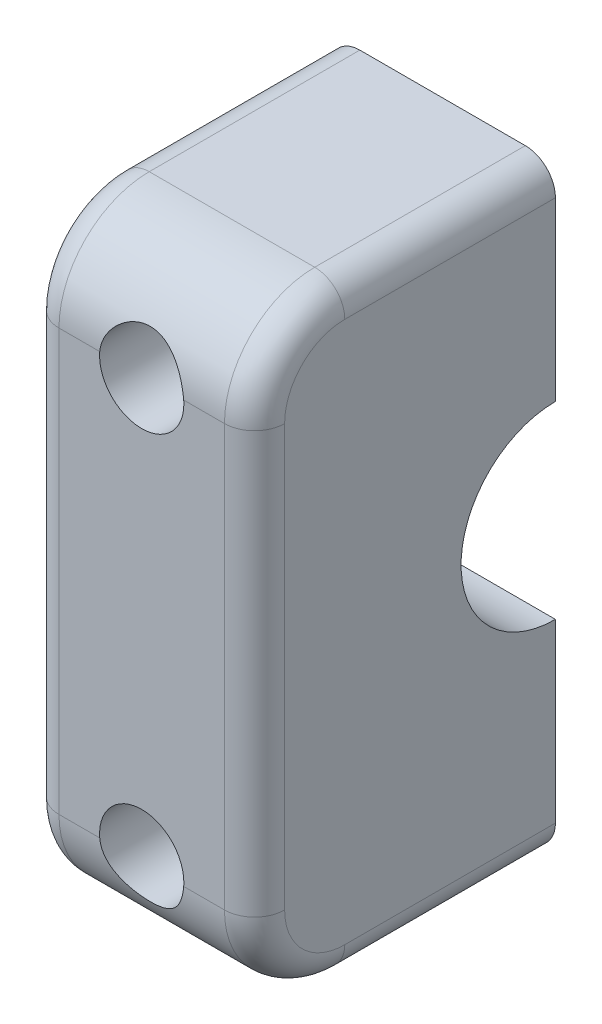
ISO-10303-21;
HEADER;
FILE_DESCRIPTION(('STEP AP214'),'2;1');
FILE_NAME('part.step','',(''),(''),'','','');
FILE_SCHEMA(('AUTOMOTIVE_DESIGN { 1 0 10303 214 1 1 1 1 }'));
ENDSEC;
DATA;
#1=APPLICATION_CONTEXT('core data for automotive mechanical design processes');
#2=APPLICATION_PROTOCOL_DEFINITION('international standard','automotive_design',2000,#1);
#3=PRODUCT_CONTEXT('',#1,'mechanical');
#4=PRODUCT('Part','Part','',(#3));
#5=PRODUCT_RELATED_PRODUCT_CATEGORY('part','',(#4));
#6=PRODUCT_DEFINITION_FORMATION('','',#4);
#7=PRODUCT_DEFINITION_CONTEXT('part definition',#1,'design');
#8=PRODUCT_DEFINITION('design','',#6,#7);
#9=PRODUCT_DEFINITION_SHAPE('','',#8);
#10=(LENGTH_UNIT() NAMED_UNIT(*) SI_UNIT(.MILLI.,.METRE.));
#11=(NAMED_UNIT(*) PLANE_ANGLE_UNIT() SI_UNIT($,.RADIAN.));
#12=(NAMED_UNIT(*) SI_UNIT($,.STERADIAN.) SOLID_ANGLE_UNIT());
#13=UNCERTAINTY_MEASURE_WITH_UNIT(LENGTH_MEASURE(1.E-05),#10,'distance_accuracy_value','');
#14=(GEOMETRIC_REPRESENTATION_CONTEXT(3) GLOBAL_UNCERTAINTY_ASSIGNED_CONTEXT((#13)) GLOBAL_UNIT_ASSIGNED_CONTEXT((#10,
#11,#12)) REPRESENTATION_CONTEXT('',''));
#15=CARTESIAN_POINT('',(0.,0.,0.));
#16=DIRECTION('',(0.,0.,1.));
#17=DIRECTION('',(1.,0.,0.));
#18=AXIS2_PLACEMENT_3D('',#15,#16,#17);
#19=CARTESIAN_POINT('',(14.1609089298663,-39.0715500000002,0.));
#20=DIRECTION('',(-1.,0.,0.));
#21=DIRECTION('',(0.,0.,1.));
#22=AXIS2_PLACEMENT_3D('',#19,#20,#21);
#23=CYLINDRICAL_SURFACE('',#22,3.9818337912088);
#24=CARTESIAN_POINT('',(8.69990892986628,-39.0715500000002,0.));
#25=DIRECTION('',(-1.,0.,0.));
#26=DIRECTION('',(0.,0.,1.));
#27=AXIS2_PLACEMENT_3D('',#24,#25,#26);
#28=CIRCLE('',#27,3.9818337912088);
#29=CARTESIAN_POINT('',(8.69990892986628,-35.0897162087914,0.));
#30=VERTEX_POINT('',#29);
#31=CARTESIAN_POINT('',(8.69990892986628,-43.053383791209,0.));
#32=VERTEX_POINT('',#31);
#33=EDGE_CURVE('E212',#30,#32,#28,.F.);
#34=ORIENTED_EDGE('',*,*,#33,.F.);
#35=DIRECTION('',(-1.,0.,0.));
#36=VECTOR('',#35,1.);
#37=CARTESIAN_POINT('',(14.1609089298663,-35.0897162087914,0.));
#38=LINE('',#37,#36);
#39=CARTESIAN_POINT('',(14.1609089298663,-35.0897162087914,0.));
#40=VERTEX_POINT('',#39);
#41=EDGE_CURVE('E195',#30,#40,#38,.F.);
#42=ORIENTED_EDGE('',*,*,#41,.T.);
#43=CARTESIAN_POINT('',(14.1609089298663,-39.0715500000002,0.));
#44=DIRECTION('',(-1.,0.,0.));
#45=DIRECTION('',(0.,0.,1.));
#46=AXIS2_PLACEMENT_3D('',#43,#44,#45);
#47=CIRCLE('',#46,3.9818337912088);
#48=CARTESIAN_POINT('',(14.1609089298663,-43.053383791209,0.));
#49=VERTEX_POINT('',#48);
#50=EDGE_CURVE('E205',#49,#40,#47,.T.);
#51=ORIENTED_EDGE('',*,*,#50,.F.);
#52=DIRECTION('',(-1.,0.,0.));
#53=VECTOR('',#52,1.);
#54=CARTESIAN_POINT('',(14.1609089298663,-43.053383791209,0.));
#55=LINE('',#54,#53);
#56=EDGE_CURVE('E209',#49,#32,#55,.T.);
#57=ORIENTED_EDGE('',*,*,#56,.T.);
#58=EDGE_LOOP('',(#34,#42,#51,#57));
#59=FACE_BOUND('',#58,.T.);
#60=ADVANCED_FACE('F34',(#59),#23,.F.);
#61=CARTESIAN_POINT('',(0.,0.,0.));
#62=DIRECTION('',(0.,0.,-1.));
#63=DIRECTION('',(-1.,0.,0.));
#64=AXIS2_PLACEMENT_3D('',#61,#62,#63);
#65=PLANE('',#64);
#66=CARTESIAN_POINT('',(9.39840892986626,-47.80915,0.));
#67=DIRECTION('',(0.,0.,1.));
#68=DIRECTION('',(1.,0.,0.));
#69=AXIS2_PLACEMENT_3D('',#66,#67,#68);
#70=CIRCLE('',#69,1.778);
#71=CARTESIAN_POINT('',(11.1764089298663,-47.80915,0.));
#72=VERTEX_POINT('',#71);
#73=EDGE_CURVE('E384',#72,#72,#70,.T.);
#74=ORIENTED_EDGE('',*,*,#73,.T.);
#75=EDGE_LOOP('',(#74));
#76=FACE_BOUND('',#75,.T.);
#77=DIRECTION('',(-1.,0.,0.));
#78=VECTOR('',#77,1.);
#79=CARTESIAN_POINT('',(8.69990892986628,-45.4215500000002,0.));
#80=LINE('',#79,#78);
#81=CARTESIAN_POINT('',(8.69990892986628,-45.4215500000002,0.));
#82=VERTEX_POINT('',#81);
#83=CARTESIAN_POINT('',(4.63590892986628,-45.4215500000002,0.));
#84=VERTEX_POINT('',#83);
#85=EDGE_CURVE('E401',#82,#84,#80,.T.);
#86=ORIENTED_EDGE('',*,*,#85,.F.);
#87=DIRECTION('',(0.,1.,0.));
#88=VECTOR('',#87,1.);
#89=CARTESIAN_POINT('',(8.69990892986628,0.,0.));
#90=LINE('',#89,#88);
#91=EDGE_CURVE('E398',#82,#32,#90,.T.);
#92=ORIENTED_EDGE('',*,*,#91,.T.);
#93=ORIENTED_EDGE('',*,*,#56,.F.);
#94=DIRECTION('',(0.,1.,0.));
#95=VECTOR('',#94,1.);
#96=CARTESIAN_POINT('',(14.1609089298663,-51.77155,0.));
#97=LINE('',#96,#95);
#98=CARTESIAN_POINT('',(14.1609089298663,-50.50155,0.));
#99=VERTEX_POINT('',#98);
#100=EDGE_CURVE('E408',#99,#49,#97,.T.);
#101=ORIENTED_EDGE('',*,*,#100,.F.);
#102=CARTESIAN_POINT('',(12.8909089298663,-50.50155,0.));
#103=DIRECTION('',(0.,0.,-1.));
#104=DIRECTION('',(-1.,0.,0.));
#105=AXIS2_PLACEMENT_3D('',#102,#103,#104);
#106=CIRCLE('',#105,1.27);
#107=CARTESIAN_POINT('',(12.8909089298663,-51.77155,0.));
#108=VERTEX_POINT('',#107);
#109=EDGE_CURVE('E320',#99,#108,#106,.T.);
#110=ORIENTED_EDGE('',*,*,#109,.T.);
#111=DIRECTION('',(1.,0.,0.));
#112=VECTOR('',#111,1.);
#113=CARTESIAN_POINT('',(14.1609089298663,-51.77155,0.));
#114=LINE('',#113,#112);
#115=CARTESIAN_POINT('',(5.90590892986629,-51.77155,0.));
#116=VERTEX_POINT('',#115);
#117=EDGE_CURVE('E201',#116,#108,#114,.T.);
#118=ORIENTED_EDGE('',*,*,#117,.F.);
#119=CARTESIAN_POINT('',(5.90590892986628,-50.50155,0.));
#120=DIRECTION('',(0.,0.,-1.));
#121=DIRECTION('',(-1.,0.,0.));
#122=AXIS2_PLACEMENT_3D('',#119,#120,#121);
#123=CIRCLE('',#122,1.27);
#124=CARTESIAN_POINT('',(4.63590892986628,-50.50155,0.));
#125=VERTEX_POINT('',#124);
#126=EDGE_CURVE('E420',#116,#125,#123,.T.);
#127=ORIENTED_EDGE('',*,*,#126,.T.);
#128=DIRECTION('',(0.,-1.,0.));
#129=VECTOR('',#128,1.);
#130=CARTESIAN_POINT('',(4.63590892986628,-51.77155,0.));
#131=LINE('',#130,#129);
#132=EDGE_CURVE('E375',#84,#125,#131,.T.);
#133=ORIENTED_EDGE('',*,*,#132,.F.);
#134=EDGE_LOOP('',(#86,#92,#93,#101,#110,#118,#127,#133));
#135=FACE_BOUND('',#134,.T.);
#136=ADVANCED_FACE('F238',(#76,#135),#65,.T.);
#137=CARTESIAN_POINT('',(14.1609089298663,-51.77155,12.7));
#138=DIRECTION('',(-1.,0.,0.));
#139=DIRECTION('',(0.,0.,1.));
#140=AXIS2_PLACEMENT_3D('',#137,#138,#139);
#141=PLANE('',#140);
#142=ORIENTED_EDGE('',*,*,#100,.T.);
#143=ORIENTED_EDGE('',*,*,#50,.T.);
#144=CARTESIAN_POINT('',(14.1609089298663,-27.64155,0.));
#145=VERTEX_POINT('',#144);
#146=EDGE_CURVE('E407',#40,#145,#97,.T.);
#147=ORIENTED_EDGE('',*,*,#146,.T.);
#148=DIRECTION('',(0.,0.,-1.));
#149=VECTOR('',#148,1.);
#150=CARTESIAN_POINT('',(14.1609089298663,-27.64155,12.7));
#151=LINE('',#150,#149);
#152=CARTESIAN_POINT('',(14.1609089298663,-27.64155,8.89));
#153=VERTEX_POINT('',#152);
#154=EDGE_CURVE('E323',#145,#153,#151,.F.);
#155=ORIENTED_EDGE('',*,*,#154,.T.);
#156=CARTESIAN_POINT('',(14.1609089298663,-30.18155,8.89));
#157=DIRECTION('',(-1.,0.,0.));
#158=DIRECTION('',(0.,0.,1.));
#159=AXIS2_PLACEMENT_3D('',#156,#157,#158);
#160=CIRCLE('',#159,2.54);
#161=CARTESIAN_POINT('',(14.1609089298663,-30.18155,11.43));
#162=VERTEX_POINT('',#161);
#163=EDGE_CURVE('E316',#162,#153,#160,.T.);
#164=ORIENTED_EDGE('',*,*,#163,.F.);
#165=DIRECTION('',(0.,1.,0.));
#166=VECTOR('',#165,1.);
#167=CARTESIAN_POINT('',(14.1609089298663,-51.77155,11.43));
#168=LINE('',#167,#166);
#169=CARTESIAN_POINT('',(14.1609089298663,-47.96155,11.43));
#170=VERTEX_POINT('',#169);
#171=EDGE_CURVE('E315',#162,#170,#168,.F.);
#172=ORIENTED_EDGE('',*,*,#171,.T.);
#173=CARTESIAN_POINT('',(14.1609089298663,-47.96155,8.89));
#174=DIRECTION('',(-1.,0.,0.));
#175=DIRECTION('',(0.,0.,1.));
#176=AXIS2_PLACEMENT_3D('',#173,#174,#175);
#177=CIRCLE('',#176,2.54);
#178=CARTESIAN_POINT('',(14.1609089298663,-50.50155,8.89));
#179=VERTEX_POINT('',#178);
#180=EDGE_CURVE('E304',#179,#170,#177,.T.);
#181=ORIENTED_EDGE('',*,*,#180,.F.);
#182=DIRECTION('',(0.,0.,-1.));
#183=VECTOR('',#182,1.);
#184=CARTESIAN_POINT('',(14.1609089298663,-50.50155,12.7));
#185=LINE('',#184,#183);
#186=EDGE_CURVE('E312',#179,#99,#185,.T.);
#187=ORIENTED_EDGE('',*,*,#186,.T.);
#188=EDGE_LOOP('',(#142,#143,#147,#155,#164,#172,#181,#187));
#189=FACE_BOUND('',#188,.T.);
#190=ADVANCED_FACE('F252',(#189),#141,.F.);
#191=CARTESIAN_POINT('',(4.63590892986628,-51.77155,12.7));
#192=DIRECTION('',(1.,0.,0.));
#193=DIRECTION('',(0.,0.,-1.));
#194=AXIS2_PLACEMENT_3D('',#191,#192,#193);
#195=PLANE('',#194);
#196=CARTESIAN_POINT('',(4.63590892986628,-27.64155,0.));
#197=VERTEX_POINT('',#196);
#198=CARTESIAN_POINT('',(4.63590892986628,-32.7215500000002,0.));
#199=VERTEX_POINT('',#198);
#200=EDGE_CURVE('E413',#197,#199,#131,.T.);
#201=ORIENTED_EDGE('',*,*,#200,.T.);
#202=CARTESIAN_POINT('',(4.63590892986628,-39.0715500000002,0.));
#203=DIRECTION('',(-1.,0.,0.));
#204=DIRECTION('',(0.,0.,1.));
#205=AXIS2_PLACEMENT_3D('',#202,#203,#204);
#206=CIRCLE('',#205,6.35);
#207=EDGE_CURVE('E386',#84,#199,#206,.T.);
#208=ORIENTED_EDGE('',*,*,#207,.F.);
#209=ORIENTED_EDGE('',*,*,#132,.T.);
#210=DIRECTION('',(0.,0.,-1.));
#211=VECTOR('',#210,1.);
#212=CARTESIAN_POINT('',(4.63590892986628,-50.50155,12.7));
#213=LINE('',#212,#211);
#214=CARTESIAN_POINT('',(4.63590892986628,-50.50155,8.89));
#215=VERTEX_POINT('',#214);
#216=EDGE_CURVE('E332',#125,#215,#213,.F.);
#217=ORIENTED_EDGE('',*,*,#216,.T.);
#218=CARTESIAN_POINT('',(4.63590892986628,-47.96155,8.89));
#219=DIRECTION('',(1.,0.,0.));
#220=DIRECTION('',(0.,0.,-1.));
#221=AXIS2_PLACEMENT_3D('',#218,#219,#220);
#222=CIRCLE('',#221,2.54);
#223=CARTESIAN_POINT('',(4.63590892986628,-47.96155,11.43));
#224=VERTEX_POINT('',#223);
#225=EDGE_CURVE('E353',#224,#215,#222,.T.);
#226=ORIENTED_EDGE('',*,*,#225,.F.);
#227=DIRECTION('',(0.,-1.,0.));
#228=VECTOR('',#227,1.);
#229=CARTESIAN_POINT('',(4.63590892986628,-51.77155,11.43));
#230=LINE('',#229,#228);
#231=CARTESIAN_POINT('',(4.63590892986628,-30.18155,11.43));
#232=VERTEX_POINT('',#231);
#233=EDGE_CURVE('E335',#224,#232,#230,.F.);
#234=ORIENTED_EDGE('',*,*,#233,.T.);
#235=CARTESIAN_POINT('',(4.63590892986628,-30.18155,8.89));
#236=DIRECTION('',(1.,0.,0.));
#237=DIRECTION('',(0.,0.,-1.));
#238=AXIS2_PLACEMENT_3D('',#235,#236,#237);
#239=CIRCLE('',#238,2.54);
#240=CARTESIAN_POINT('',(4.63590892986628,-27.64155,8.89));
#241=VERTEX_POINT('',#240);
#242=EDGE_CURVE('E317',#241,#232,#239,.T.);
#243=ORIENTED_EDGE('',*,*,#242,.F.);
#244=DIRECTION('',(0.,0.,-1.));
#245=VECTOR('',#244,1.);
#246=CARTESIAN_POINT('',(4.63590892986628,-27.64155,12.7));
#247=LINE('',#246,#245);
#248=EDGE_CURVE('E338',#241,#197,#247,.T.);
#249=ORIENTED_EDGE('',*,*,#248,.T.);
#250=EDGE_LOOP('',(#201,#208,#209,#217,#226,#234,#243,#249));
#251=FACE_BOUND('',#250,.T.);
#252=ADVANCED_FACE('F248',(#251),#195,.F.);
#253=CARTESIAN_POINT('',(14.1609089298663,-51.77155,12.7));
#254=DIRECTION('',(0.,1.,0.));
#255=DIRECTION('',(0.,0.,1.));
#256=AXIS2_PLACEMENT_3D('',#253,#254,#255);
#257=PLANE('',#256);
#258=DIRECTION('',(0.,0.,-1.));
#259=VECTOR('',#258,1.);
#260=CARTESIAN_POINT('',(12.8909089298663,-51.77155,12.7));
#261=LINE('',#260,#259);
#262=CARTESIAN_POINT('',(12.8909089298663,-51.77155,8.89));
#263=VERTEX_POINT('',#262);
#264=EDGE_CURVE('E346',#108,#263,#261,.F.);
#265=ORIENTED_EDGE('',*,*,#264,.T.);
#266=DIRECTION('',(1.,0.,0.));
#267=VECTOR('',#266,1.);
#268=CARTESIAN_POINT('',(14.1609089298663,-51.77155,8.89));
#269=LINE('',#268,#267);
#270=CARTESIAN_POINT('',(5.90590892986628,-51.77155,8.89));
#271=VERTEX_POINT('',#270);
#272=EDGE_CURVE('E191',#263,#271,#269,.F.);
#273=ORIENTED_EDGE('',*,*,#272,.T.);
#274=DIRECTION('',(0.,0.,-1.));
#275=VECTOR('',#274,1.);
#276=CARTESIAN_POINT('',(5.90590892986628,-51.77155,12.7));
#277=LINE('',#276,#275);
#278=EDGE_CURVE('E344',#271,#116,#277,.T.);
#279=ORIENTED_EDGE('',*,*,#278,.T.);
#280=ORIENTED_EDGE('',*,*,#117,.T.);
#281=EDGE_LOOP('',(#265,#273,#279,#280));
#282=FACE_BOUND('',#281,.T.);
#283=ADVANCED_FACE('F251',(#282),#257,.F.);
#284=CARTESIAN_POINT('',(14.1609089298663,-26.37155,12.7));
#285=DIRECTION('',(0.,-1.,0.));
#286=DIRECTION('',(1.,0.,0.));
#287=AXIS2_PLACEMENT_3D('',#284,#285,#286);
#288=PLANE('',#287);
#289=DIRECTION('',(0.,0.,-1.));
#290=VECTOR('',#289,1.);
#291=CARTESIAN_POINT('',(5.90590892986628,-26.37155,12.7));
#292=LINE('',#291,#290);
#293=CARTESIAN_POINT('',(5.90590892986628,-26.37155,0.));
#294=VERTEX_POINT('',#293);
#295=CARTESIAN_POINT('',(5.90590892986628,-26.37155,8.89));
#296=VERTEX_POINT('',#295);
#297=EDGE_CURVE('E415',#294,#296,#292,.F.);
#298=ORIENTED_EDGE('',*,*,#297,.T.);
#299=DIRECTION('',(-1.,0.,0.));
#300=VECTOR('',#299,1.);
#301=CARTESIAN_POINT('',(14.1609089298663,-26.37155,8.89));
#302=LINE('',#301,#300);
#303=CARTESIAN_POINT('',(12.8909089298663,-26.37155,8.89));
#304=VERTEX_POINT('',#303);
#305=EDGE_CURVE('E193',#296,#304,#302,.F.);
#306=ORIENTED_EDGE('',*,*,#305,.T.);
#307=DIRECTION('',(0.,0.,-1.));
#308=VECTOR('',#307,1.);
#309=CARTESIAN_POINT('',(12.8909089298663,-26.37155,12.7));
#310=LINE('',#309,#308);
#311=CARTESIAN_POINT('',(12.8909089298663,-26.37155,0.));
#312=VERTEX_POINT('',#311);
#313=EDGE_CURVE('E418',#304,#312,#310,.T.);
#314=ORIENTED_EDGE('',*,*,#313,.T.);
#315=DIRECTION('',(-1.,0.,0.));
#316=VECTOR('',#315,1.);
#317=CARTESIAN_POINT('',(14.1609089298663,-26.37155,0.));
#318=LINE('',#317,#316);
#319=EDGE_CURVE('E410',#312,#294,#318,.T.);
#320=ORIENTED_EDGE('',*,*,#319,.T.);
#321=EDGE_LOOP('',(#298,#306,#314,#320));
#322=FACE_BOUND('',#321,.T.);
#323=ADVANCED_FACE('F243',(#322),#288,.F.);
#324=CARTESIAN_POINT('',(0.,0.,12.7));
#325=DIRECTION('',(0.,0.,-1.));
#326=DIRECTION('',(-1.,0.,0.));
#327=AXIS2_PLACEMENT_3D('',#324,#325,#326);
#328=PLANE('',#327);
#329=DIRECTION('',(-1.,0.,0.));
#330=VECTOR('',#329,1.);
#331=CARTESIAN_POINT('',(0.,-30.18155,12.7));
#332=LINE('',#331,#330);
#333=CARTESIAN_POINT('',(12.8909089298663,-30.18155,12.7));
#334=VERTEX_POINT('',#333);
#335=CARTESIAN_POINT('',(11.1698654605207,-30.18155,12.7));
#336=VERTEX_POINT('',#335);
#337=EDGE_CURVE('E172',#334,#336,#332,.T.);
#338=ORIENTED_EDGE('',*,*,#337,.T.);
#339=CARTESIAN_POINT('',(9.39840892986618,-30.3339500000001,12.7));
#340=DIRECTION('',(0.,0.,1.));
#341=DIRECTION('',(1.,0.,0.));
#342=AXIS2_PLACEMENT_3D('',#339,#340,#341);
#343=CIRCLE('',#342,1.77799999999959);
#344=CARTESIAN_POINT('',(7.62695239921166,-30.18155,12.7));
#345=VERTEX_POINT('',#344);
#346=EDGE_CURVE('E52',#345,#336,#343,.T.);
#347=ORIENTED_EDGE('',*,*,#346,.F.);
#348=CARTESIAN_POINT('',(5.90590892986628,-30.18155,12.7));
#349=VERTEX_POINT('',#348);
#350=EDGE_CURVE('E169',#345,#349,#332,.T.);
#351=ORIENTED_EDGE('',*,*,#350,.T.);
#352=DIRECTION('',(0.,-1.,0.));
#353=VECTOR('',#352,1.);
#354=CARTESIAN_POINT('',(5.90590892986628,0.,12.7));
#355=LINE('',#354,#353);
#356=CARTESIAN_POINT('',(5.90590892986628,-47.96155,12.7));
#357=VERTEX_POINT('',#356);
#358=EDGE_CURVE('E342',#349,#357,#355,.T.);
#359=ORIENTED_EDGE('',*,*,#358,.T.);
#360=DIRECTION('',(1.,0.,0.));
#361=VECTOR('',#360,1.);
#362=CARTESIAN_POINT('',(0.,-47.96155,12.7));
#363=LINE('',#362,#361);
#364=CARTESIAN_POINT('',(7.62695239921133,-47.96155,12.7));
#365=VERTEX_POINT('',#364);
#366=EDGE_CURVE('E188',#357,#365,#363,.T.);
#367=ORIENTED_EDGE('',*,*,#366,.T.);
#368=CARTESIAN_POINT('',(9.39840892986626,-47.80915,12.7));
#369=DIRECTION('',(0.,0.,1.));
#370=DIRECTION('',(1.,0.,0.));
#371=AXIS2_PLACEMENT_3D('',#368,#369,#370);
#372=CIRCLE('',#371,1.778);
#373=CARTESIAN_POINT('',(11.1698654605212,-47.96155,12.7));
#374=VERTEX_POINT('',#373);
#375=EDGE_CURVE('E59',#374,#365,#372,.T.);
#376=ORIENTED_EDGE('',*,*,#375,.F.);
#377=CARTESIAN_POINT('',(12.8909089298663,-47.96155,12.7));
#378=VERTEX_POINT('',#377);
#379=EDGE_CURVE('E183',#374,#378,#363,.T.);
#380=ORIENTED_EDGE('',*,*,#379,.T.);
#381=DIRECTION('',(0.,1.,0.));
#382=VECTOR('',#381,1.);
#383=CARTESIAN_POINT('',(12.8909089298663,0.,12.7));
#384=LINE('',#383,#382);
#385=EDGE_CURVE('E340',#378,#334,#384,.T.);
#386=ORIENTED_EDGE('',*,*,#385,.T.);
#387=EDGE_LOOP('',(#338,#347,#351,#359,#367,#376,#380,#386));
#388=FACE_BOUND('',#387,.T.);
#389=ADVANCED_FACE('F167',(#388),#328,.F.);
#390=CARTESIAN_POINT('',(9.39840892986618,-30.3339500000001,0.));
#391=DIRECTION('',(0.,0.,1.));
#392=DIRECTION('',(1.,0.,0.));
#393=AXIS2_PLACEMENT_3D('',#390,#391,#392);
#394=CIRCLE('',#393,1.77799999999959);
#395=CARTESIAN_POINT('',(11.1764089298658,-30.3339500000001,0.));
#396=VERTEX_POINT('',#395);
#397=EDGE_CURVE('E173',#396,#396,#394,.T.);
#398=ORIENTED_EDGE('',*,*,#397,.T.);
#399=EDGE_LOOP('',(#398));
#400=FACE_BOUND('',#399,.T.);
#401=DIRECTION('',(-1.,0.,0.));
#402=VECTOR('',#401,1.);
#403=CARTESIAN_POINT('',(8.69990892986628,-32.7215500000002,0.));
#404=LINE('',#403,#402);
#405=CARTESIAN_POINT('',(8.69990892986628,-32.7215500000002,0.));
#406=VERTEX_POINT('',#405);
#407=EDGE_CURVE('E214',#199,#406,#404,.F.);
#408=ORIENTED_EDGE('',*,*,#407,.F.);
#409=ORIENTED_EDGE('',*,*,#200,.F.);
#410=CARTESIAN_POINT('',(5.90590892986628,-27.64155,0.));
#411=DIRECTION('',(0.,0.,-1.));
#412=DIRECTION('',(-1.,0.,0.));
#413=AXIS2_PLACEMENT_3D('',#410,#411,#412);
#414=CIRCLE('',#413,1.27);
#415=EDGE_CURVE('E326',#197,#294,#414,.T.);
#416=ORIENTED_EDGE('',*,*,#415,.T.);
#417=ORIENTED_EDGE('',*,*,#319,.F.);
#418=CARTESIAN_POINT('',(12.8909089298663,-27.64155,0.));
#419=DIRECTION('',(0.,0.,-1.));
#420=DIRECTION('',(-1.,0.,0.));
#421=AXIS2_PLACEMENT_3D('',#418,#419,#420);
#422=CIRCLE('',#421,1.27);
#423=EDGE_CURVE('E321',#312,#145,#422,.T.);
#424=ORIENTED_EDGE('',*,*,#423,.T.);
#425=ORIENTED_EDGE('',*,*,#146,.F.);
#426=ORIENTED_EDGE('',*,*,#41,.F.);
#427=DIRECTION('',(0.,1.,0.));
#428=VECTOR('',#427,1.);
#429=CARTESIAN_POINT('',(8.69990892986628,0.,0.));
#430=LINE('',#429,#428);
#431=EDGE_CURVE('E394',#30,#406,#430,.T.);
#432=ORIENTED_EDGE('',*,*,#431,.T.);
#433=EDGE_LOOP('',(#408,#409,#416,#417,#424,#425,#426,#432));
#434=FACE_BOUND('',#433,.T.);
#435=ADVANCED_FACE('F242',(#400,#434),#65,.T.);
#436=CARTESIAN_POINT('',(12.8909089298663,-50.50155,12.7));
#437=DIRECTION('',(0.,0.,-1.));
#438=DIRECTION('',(-1.,0.,0.));
#439=AXIS2_PLACEMENT_3D('',#436,#437,#438);
#440=CYLINDRICAL_SURFACE('',#439,1.27);
#441=ORIENTED_EDGE('',*,*,#186,.F.);
#442=CARTESIAN_POINT('',(12.8909089298663,-50.50155,8.89));
#443=DIRECTION('',(0.,0.,-1.));
#444=DIRECTION('',(-1.,0.,0.));
#445=AXIS2_PLACEMENT_3D('',#442,#443,#444);
#446=CIRCLE('',#445,1.27);
#447=EDGE_CURVE('E184',#179,#263,#446,.T.);
#448=ORIENTED_EDGE('',*,*,#447,.T.);
#449=ORIENTED_EDGE('',*,*,#264,.F.);
#450=ORIENTED_EDGE('',*,*,#109,.F.);
#451=EDGE_LOOP('',(#441,#448,#449,#450));
#452=FACE_BOUND('',#451,.T.);
#453=ADVANCED_FACE('F246',(#452),#440,.T.);
#454=CARTESIAN_POINT('',(12.8909089298663,0.,11.43));
#455=DIRECTION('',(0.,1.,0.));
#456=DIRECTION('',(0.,0.,1.));
#457=AXIS2_PLACEMENT_3D('',#454,#455,#456);
#458=CYLINDRICAL_SURFACE('',#457,1.27);
#459=ORIENTED_EDGE('',*,*,#385,.F.);
#460=CARTESIAN_POINT('',(12.8909089298663,-47.96155,11.43));
#461=DIRECTION('',(0.,1.,0.));
#462=DIRECTION('',(0.,0.,1.));
#463=AXIS2_PLACEMENT_3D('',#460,#461,#462);
#464=CIRCLE('',#463,1.27);
#465=EDGE_CURVE('E363',#378,#170,#464,.T.);
#466=ORIENTED_EDGE('',*,*,#465,.T.);
#467=ORIENTED_EDGE('',*,*,#171,.F.);
#468=CARTESIAN_POINT('',(12.8909089298663,-30.18155,11.43));
#469=DIRECTION('',(0.,-1.,0.));
#470=DIRECTION('',(0.,0.,-1.));
#471=AXIS2_PLACEMENT_3D('',#468,#469,#470);
#472=CIRCLE('',#471,1.27);
#473=EDGE_CURVE('E361',#162,#334,#472,.T.);
#474=ORIENTED_EDGE('',*,*,#473,.T.);
#475=EDGE_LOOP('',(#459,#466,#467,#474));
#476=FACE_BOUND('',#475,.T.);
#477=ADVANCED_FACE('F267',(#476),#458,.T.);
#478=CARTESIAN_POINT('',(12.8909089298663,-27.64155,12.7));
#479=DIRECTION('',(0.,0.,-1.));
#480=DIRECTION('',(-1.,0.,0.));
#481=AXIS2_PLACEMENT_3D('',#478,#479,#480);
#482=CYLINDRICAL_SURFACE('',#481,1.27);
#483=ORIENTED_EDGE('',*,*,#313,.F.);
#484=CARTESIAN_POINT('',(12.8909089298663,-27.64155,8.89));
#485=DIRECTION('',(0.,0.,-1.));
#486=DIRECTION('',(-1.,0.,0.));
#487=AXIS2_PLACEMENT_3D('',#484,#485,#486);
#488=CIRCLE('',#487,1.27);
#489=EDGE_CURVE('E359',#304,#153,#488,.T.);
#490=ORIENTED_EDGE('',*,*,#489,.T.);
#491=ORIENTED_EDGE('',*,*,#154,.F.);
#492=ORIENTED_EDGE('',*,*,#423,.F.);
#493=EDGE_LOOP('',(#483,#490,#491,#492));
#494=FACE_BOUND('',#493,.T.);
#495=ADVANCED_FACE('F263',(#494),#482,.T.);
#496=CARTESIAN_POINT('',(5.90590892986628,-50.50155,12.7));
#497=DIRECTION('',(0.,0.,-1.));
#498=DIRECTION('',(-1.,0.,0.));
#499=AXIS2_PLACEMENT_3D('',#496,#497,#498);
#500=CYLINDRICAL_SURFACE('',#499,1.27);
#501=ORIENTED_EDGE('',*,*,#278,.F.);
#502=CARTESIAN_POINT('',(5.90590892986628,-50.50155,8.89));
#503=DIRECTION('',(0.,0.,-1.));
#504=DIRECTION('',(-1.,0.,0.));
#505=AXIS2_PLACEMENT_3D('',#502,#503,#504);
#506=CIRCLE('',#505,1.27);
#507=EDGE_CURVE('E309',#271,#215,#506,.T.);
#508=ORIENTED_EDGE('',*,*,#507,.T.);
#509=ORIENTED_EDGE('',*,*,#216,.F.);
#510=ORIENTED_EDGE('',*,*,#126,.F.);
#511=EDGE_LOOP('',(#501,#508,#509,#510));
#512=FACE_BOUND('',#511,.T.);
#513=ADVANCED_FACE('F266',(#512),#500,.T.);
#514=CARTESIAN_POINT('',(5.90590892986628,0.,11.43));
#515=DIRECTION('',(0.,-1.,0.));
#516=DIRECTION('',(0.,0.,-1.));
#517=AXIS2_PLACEMENT_3D('',#514,#515,#516);
#518=CYLINDRICAL_SURFACE('',#517,1.27);
#519=ORIENTED_EDGE('',*,*,#358,.F.);
#520=CARTESIAN_POINT('',(5.90590892986628,-30.18155,11.43));
#521=DIRECTION('',(0.,-1.,0.));
#522=DIRECTION('',(0.,0.,-1.));
#523=AXIS2_PLACEMENT_3D('',#520,#521,#522);
#524=CIRCLE('',#523,1.27);
#525=EDGE_CURVE('E350',#349,#232,#524,.T.);
#526=ORIENTED_EDGE('',*,*,#525,.T.);
#527=ORIENTED_EDGE('',*,*,#233,.F.);
#528=CARTESIAN_POINT('',(5.90590892986628,-47.96155,11.43));
#529=DIRECTION('',(0.,1.,0.));
#530=DIRECTION('',(0.,0.,1.));
#531=AXIS2_PLACEMENT_3D('',#528,#529,#530);
#532=CIRCLE('',#531,1.27);
#533=EDGE_CURVE('E348',#224,#357,#532,.T.);
#534=ORIENTED_EDGE('',*,*,#533,.T.);
#535=EDGE_LOOP('',(#519,#526,#527,#534));
#536=FACE_BOUND('',#535,.T.);
#537=ADVANCED_FACE('F279',(#536),#518,.T.);
#538=CARTESIAN_POINT('',(5.90590892986628,-27.64155,12.7));
#539=DIRECTION('',(0.,0.,-1.));
#540=DIRECTION('',(-1.,0.,0.));
#541=AXIS2_PLACEMENT_3D('',#538,#539,#540);
#542=CYLINDRICAL_SURFACE('',#541,1.27);
#543=ORIENTED_EDGE('',*,*,#248,.F.);
#544=CARTESIAN_POINT('',(5.90590892986628,-27.64155,8.89));
#545=DIRECTION('',(0.,0.,-1.));
#546=DIRECTION('',(-1.,0.,0.));
#547=AXIS2_PLACEMENT_3D('',#544,#545,#546);
#548=CIRCLE('',#547,1.27);
#549=EDGE_CURVE('E181',#241,#296,#548,.T.);
#550=ORIENTED_EDGE('',*,*,#549,.T.);
#551=ORIENTED_EDGE('',*,*,#297,.F.);
#552=ORIENTED_EDGE('',*,*,#415,.F.);
#553=EDGE_LOOP('',(#543,#550,#551,#552));
#554=FACE_BOUND('',#553,.T.);
#555=ADVANCED_FACE('F275',(#554),#542,.T.);
#556=CARTESIAN_POINT('',(12.8909089298663,-30.18155,8.89));
#557=DIRECTION('',(-1.,0.,0.));
#558=DIRECTION('',(0.,0.,1.));
#559=AXIS2_PLACEMENT_3D('',#556,#557,#558);
#560=TOROIDAL_SURFACE('',#559,2.54,1.27);
#561=ORIENTED_EDGE('',*,*,#163,.T.);
#562=ORIENTED_EDGE('',*,*,#489,.F.);
#563=CARTESIAN_POINT('',(12.8909089298663,-30.18155,8.89));
#564=DIRECTION('',(-1.,0.,0.));
#565=DIRECTION('',(0.,0.,1.));
#566=AXIS2_PLACEMENT_3D('',#563,#564,#565);
#567=CIRCLE('',#566,3.81);
#568=EDGE_CURVE('E197',#334,#304,#567,.T.);
#569=ORIENTED_EDGE('',*,*,#568,.F.);
#570=ORIENTED_EDGE('',*,*,#473,.F.);
#571=EDGE_LOOP('',(#561,#562,#569,#570));
#572=FACE_BOUND('',#571,.T.);
#573=ADVANCED_FACE('F278',(#572),#560,.T.);
#574=CARTESIAN_POINT('',(0.,-30.18155,8.89));
#575=DIRECTION('',(-1.,0.,0.));
#576=DIRECTION('',(0.,-1.,0.));
#577=AXIS2_PLACEMENT_3D('',#574,#575,#576);
#578=CYLINDRICAL_SURFACE('',#577,3.81);
#579=CARTESIAN_POINT('',(11.1698654605207,-30.18155,12.7));
#580=CARTESIAN_POINT('',(11.1657786513856,-30.134020230714,12.7000046384727));
#581=CARTESIAN_POINT('',(11.1597755818032,-30.0866817270247,12.6991096877237));
#582=CARTESIAN_POINT('',(11.1440074878977,-29.9927193211849,12.6956073070063));
#583=CARTESIAN_POINT('',(11.1342440283378,-29.9460951301763,12.6930005890161));
#584=CARTESIAN_POINT('',(11.0995262111666,-29.8081889593687,12.6827753994882));
#585=CARTESIAN_POINT('',(11.0691024591423,-29.7183970630013,12.6727501517201));
#586=CARTESIAN_POINT('',(10.994833147075,-29.5455522270563,12.6475593686949));
#587=CARTESIAN_POINT('',(10.9510034101458,-29.4624914881006,12.6323998911294));
#588=CARTESIAN_POINT('',(10.8512168955338,-29.3047001845144,12.5986051833531));
#589=CARTESIAN_POINT('',(10.7952481342593,-29.2299779628245,12.5799665210583));
#590=CARTESIAN_POINT('',(10.6692267951791,-29.0865888442996,12.5400687732052));
#591=CARTESIAN_POINT('',(10.5985717456862,-29.018475946414,12.5187221519217));
#592=CARTESIAN_POINT('',(10.4469009200106,-28.8946667928637,12.4766856292481));
#593=CARTESIAN_POINT('',(10.3658817082876,-28.838974671342,12.4559959484741));
#594=CARTESIAN_POINT('',(10.1915843353301,-28.7393832141678,12.4169313002291));
#595=CARTESIAN_POINT('',(10.0979341834799,-28.6960775149763,12.3986900715626));
#596=CARTESIAN_POINT('',(9.90369306212723,-28.6261431260513,12.3682586681988));
#597=CARTESIAN_POINT('',(9.80310764928583,-28.5995012534396,12.3560637118377));
#598=CARTESIAN_POINT('',(9.60514056085978,-28.5653517040772,12.340266033593));
#599=CARTESIAN_POINT('',(9.50800441755938,-28.5566686462482,12.3361365701509));
#600=CARTESIAN_POINT('',(9.31361137455559,-28.5553178189523,12.3355004473811));
#601=CARTESIAN_POINT('',(9.21635452206161,-28.5626450466961,12.338991406873));
#602=CARTESIAN_POINT('',(9.03113994821145,-28.5919348454259,12.3525787513763));
#603=CARTESIAN_POINT('',(8.94298953951694,-28.612911246488,12.3622292614024));
#604=CARTESIAN_POINT('',(8.77149797520218,-28.6677041438454,12.3864642055908));
#605=CARTESIAN_POINT('',(8.68815819492949,-28.7015242913975,12.4010500426533));
#606=CARTESIAN_POINT('',(8.52389915202012,-28.7830297225372,12.434329265291));
#607=CARTESIAN_POINT('',(8.4433259854658,-28.831339739762,12.4531955993316));
#608=CARTESIAN_POINT('',(8.2909731008308,-28.9398116838257,12.4924308619195));
#609=CARTESIAN_POINT('',(8.21919809884537,-28.9999799223767,12.5128005870412));
#610=CARTESIAN_POINT('',(8.08033499811041,-29.1363661829065,12.5545857066156));
#611=CARTESIAN_POINT('',(8.01412867219998,-29.2135012169625,12.5759478033903));
#612=CARTESIAN_POINT('',(7.89551885644559,-29.3784933123448,12.6153668887615));
#613=CARTESIAN_POINT('',(7.84310388681032,-29.4663413665352,12.6334266223687));
#614=CARTESIAN_POINT('',(7.77509422740507,-29.606611575256,12.6566903160927));
#615=CARTESIAN_POINT('',(7.75383949128989,-29.6560275169063,12.6639248944634));
#616=CARTESIAN_POINT('',(7.71582850406486,-29.7567988675398,12.6765896420318));
#617=CARTESIAN_POINT('',(7.69907197150377,-29.8081541549494,12.6820199241288));
#618=CARTESIAN_POINT('',(7.67019373062788,-29.9126332472499,12.6908605925858));
#619=CARTESIAN_POINT('',(7.65809845041167,-29.9657653323633,12.6942595198457));
#620=CARTESIAN_POINT('',(7.63880887242345,-30.0730382925186,12.6988365583653));
#621=CARTESIAN_POINT('',(7.63161761429103,-30.1271797718922,12.7000132930505));
#622=CARTESIAN_POINT('',(7.62695239921166,-30.18155,12.7));
#623=B_SPLINE_CURVE_WITH_KNOTS('',3,(#579,#580,#581,#582,#583,#584,#585,#586,#587,#588,#589,
#590,#591,#592,#593,#594,#595,#596,#597,#598,#599,#600,#601,#602,#603,#604,#605,#606,#607,#608,
#609,#610,#611,#612,#613,#614,#615,#616,#617,#618,#619,#620,#621,#622),.UNSPECIFIED.,.F.,.F.,(4,
2,2,2,2,2,2,2,2,2,2,2,2,2,2,2,2,2,2,2,2,4),(0.,0.143017988333322,0.285976528600005,
0.570478794785004,0.854646549720424,1.13909612114506,1.43908902913574,1.73918163852741,
2.05187993305196,2.36433053568039,2.65558589458855,2.94675025693952,3.21891581509314,
3.49115880323602,3.77743223511609,4.06385845375985,4.37402873799017,4.68394001680609,
4.84656089953296,5.00917160474688,5.17269116288794,5.33631198277773),.UNSPECIFIED.);
#624=EDGE_CURVE('E11',#336,#345,#623,.T.);
#625=ORIENTED_EDGE('',*,*,#624,.F.);
#626=ORIENTED_EDGE('',*,*,#337,.F.);
#627=ORIENTED_EDGE('',*,*,#568,.T.);
#628=ORIENTED_EDGE('',*,*,#305,.F.);
#629=CARTESIAN_POINT('',(5.90590892986628,-30.18155,8.89));
#630=DIRECTION('',(1.,0.,0.));
#631=DIRECTION('',(0.,0.,-1.));
#632=AXIS2_PLACEMENT_3D('',#629,#630,#631);
#633=CIRCLE('',#632,3.81);
#634=EDGE_CURVE('E179',#349,#296,#633,.F.);
#635=ORIENTED_EDGE('',*,*,#634,.F.);
#636=ORIENTED_EDGE('',*,*,#350,.F.);
#637=EDGE_LOOP('',(#625,#626,#627,#628,#635,#636));
#638=FACE_BOUND('',#637,.T.);
#639=ADVANCED_FACE('F176',(#638),#578,.T.);
#640=CARTESIAN_POINT('',(5.90590892986628,-30.18155,8.89));
#641=DIRECTION('',(1.,0.,0.));
#642=DIRECTION('',(0.,0.,-1.));
#643=AXIS2_PLACEMENT_3D('',#640,#641,#642);
#644=TOROIDAL_SURFACE('',#643,2.54,1.27);
#645=ORIENTED_EDGE('',*,*,#525,.F.);
#646=ORIENTED_EDGE('',*,*,#634,.T.);
#647=ORIENTED_EDGE('',*,*,#549,.F.);
#648=ORIENTED_EDGE('',*,*,#242,.T.);
#649=EDGE_LOOP('',(#645,#646,#647,#648));
#650=FACE_BOUND('',#649,.T.);
#651=ADVANCED_FACE('F287',(#650),#644,.T.);
#652=CARTESIAN_POINT('',(5.90590892986628,-47.96155,8.89));
#653=DIRECTION('',(1.,0.,0.));
#654=DIRECTION('',(0.,0.,-1.));
#655=AXIS2_PLACEMENT_3D('',#652,#653,#654);
#656=TOROIDAL_SURFACE('',#655,2.54,1.27);
#657=ORIENTED_EDGE('',*,*,#225,.T.);
#658=ORIENTED_EDGE('',*,*,#507,.F.);
#659=CARTESIAN_POINT('',(5.90590892986628,-47.96155,8.89));
#660=DIRECTION('',(1.,0.,0.));
#661=DIRECTION('',(0.,0.,-1.));
#662=AXIS2_PLACEMENT_3D('',#659,#660,#661);
#663=CIRCLE('',#662,3.81);
#664=EDGE_CURVE('E198',#357,#271,#663,.T.);
#665=ORIENTED_EDGE('',*,*,#664,.F.);
#666=ORIENTED_EDGE('',*,*,#533,.F.);
#667=EDGE_LOOP('',(#657,#658,#665,#666));
#668=FACE_BOUND('',#667,.T.);
#669=ADVANCED_FACE('F36',(#668),#656,.T.);
#670=CARTESIAN_POINT('',(0.,-47.96155,8.89));
#671=DIRECTION('',(1.,0.,0.));
#672=DIRECTION('',(0.,0.,-1.));
#673=AXIS2_PLACEMENT_3D('',#670,#671,#672);
#674=CYLINDRICAL_SURFACE('',#673,3.81);
#675=CARTESIAN_POINT('',(7.62695239921133,-47.96155,12.7));
#676=CARTESIAN_POINT('',(7.63103920834645,-48.0090797692861,12.7000046384727));
#677=CARTESIAN_POINT('',(7.63704227792887,-48.0564182729754,12.6991096877237));
#678=CARTESIAN_POINT('',(7.65281037183431,-48.1503806788152,12.6956073070063));
#679=CARTESIAN_POINT('',(7.66257383139419,-48.1970048698238,12.6930005890161));
#680=CARTESIAN_POINT('',(7.69729164856545,-48.3349110406314,12.6827753994882));
#681=CARTESIAN_POINT('',(7.72771540058972,-48.4247029369989,12.6727501517201));
#682=CARTESIAN_POINT('',(7.80198471265706,-48.5975477729439,12.6475593686948));
#683=CARTESIAN_POINT('',(7.84581444958625,-48.6806085118996,12.6323998911294));
#684=CARTESIAN_POINT('',(7.9456009641983,-48.8383998154858,12.598605183353));
#685=CARTESIAN_POINT('',(8.00156972547272,-48.9131220371758,12.5799665210583));
#686=CARTESIAN_POINT('',(8.12759106455294,-49.0565111557007,12.5400687732051));
#687=CARTESIAN_POINT('',(8.19824611404592,-49.1246240535863,12.5187221519216));
#688=CARTESIAN_POINT('',(8.34991693972149,-49.2484332071366,12.476685629248));
#689=CARTESIAN_POINT('',(8.43093615144458,-49.3041253286583,12.455995948474));
#690=CARTESIAN_POINT('',(8.60523352440203,-49.4037167858326,12.416931300229));
#691=CARTESIAN_POINT('',(8.69888367625232,-49.4470224850241,12.3986900715624));
#692=CARTESIAN_POINT('',(8.893124797605,-49.5169568739491,12.3682586681986));
#693=CARTESIAN_POINT('',(8.99371021044643,-49.5435987465608,12.3560637118375));
#694=CARTESIAN_POINT('',(9.19167729887253,-49.5777482959232,12.3402660335928));
#695=CARTESIAN_POINT('',(9.28881344217295,-49.5864313537523,12.3361365701507));
#696=CARTESIAN_POINT('',(9.48320648517678,-49.5877821810481,12.3355004473809));
#697=CARTESIAN_POINT('',(9.58046333767078,-49.5804549533044,12.3389914068728));
#698=CARTESIAN_POINT('',(9.76567791152098,-49.5511651545746,12.3525787513761));
#699=CARTESIAN_POINT('',(9.85382832021551,-49.5301887535125,12.3622292614022));
#700=CARTESIAN_POINT('',(10.0253198845303,-49.4753958561551,12.3864642055906));
#701=CARTESIAN_POINT('',(10.108659664803,-49.441575708603,12.4010500426531));
#702=CARTESIAN_POINT('',(10.2729187077124,-49.3600702774633,12.4343292652908));
#703=CARTESIAN_POINT('',(10.3534918742668,-49.3117602602385,12.4531955993314));
#704=CARTESIAN_POINT('',(10.5058447589018,-49.2032883161748,12.4924308619193));
#705=CARTESIAN_POINT('',(10.5776197608872,-49.1431200776237,12.5128005870411));
#706=CARTESIAN_POINT('',(10.7164828616222,-49.006733817094,12.5545857066155));
#707=CARTESIAN_POINT('',(10.7826891875327,-48.9295987830379,12.5759478033902));
#708=CARTESIAN_POINT('',(10.9012990032871,-48.7646066876556,12.6153668887615));
#709=CARTESIAN_POINT('',(10.9537139729224,-48.6767586334652,12.6334266223686));
#710=CARTESIAN_POINT('',(11.0217236323277,-48.5364884247443,12.6566903160927));
#711=CARTESIAN_POINT('',(11.0429783684429,-48.4870724830941,12.6639248944634));
#712=CARTESIAN_POINT('',(11.0809893556679,-48.3863011324605,12.6765896420317));
#713=CARTESIAN_POINT('',(11.097745888229,-48.3349458450508,12.6820199241287));
#714=CARTESIAN_POINT('',(11.1266241291049,-48.2304667527503,12.6908605925858));
#715=CARTESIAN_POINT('',(11.1387194093212,-48.1773346676369,12.6942595198457));
#716=CARTESIAN_POINT('',(11.1580089873094,-48.0700617074815,12.6988365583653));
#717=CARTESIAN_POINT('',(11.1652002454418,-48.0159202281079,12.7000132930505));
#718=CARTESIAN_POINT('',(11.1698654605212,-47.96155,12.7));
#719=B_SPLINE_CURVE_WITH_KNOTS('',3,(#675,#676,#677,#678,#679,#680,#681,#682,#683,#684,#685,
#686,#687,#688,#689,#690,#691,#692,#693,#694,#695,#696,#697,#698,#699,#700,#701,#702,#703,#704,
#705,#706,#707,#708,#709,#710,#711,#712,#713,#714,#715,#716,#717,#718),.UNSPECIFIED.,.F.,.F.,(4,
2,2,2,2,2,2,2,2,2,2,2,2,2,2,2,2,2,2,2,2,4),(0.,0.143017988333346,0.28597652860006,
0.570478794785118,0.854646549720592,1.13909612114529,1.43908902913603,1.73918163852777,
2.0518799330524,2.36433053568091,2.65558589458914,2.94675025694019,3.21891581509385,
3.49115880323678,3.77743223511689,4.06385845376071,4.37402873799111,4.68394001680711,
4.84656089953405,5.00917160474807,5.17269116288922,5.3363119827791),.UNSPECIFIED.);
#720=EDGE_CURVE('E47',#365,#374,#719,.T.);
#721=ORIENTED_EDGE('',*,*,#720,.F.);
#722=ORIENTED_EDGE('',*,*,#366,.F.);
#723=ORIENTED_EDGE('',*,*,#664,.T.);
#724=ORIENTED_EDGE('',*,*,#272,.F.);
#725=CARTESIAN_POINT('',(12.8909089298663,-47.96155,8.89));
#726=DIRECTION('',(-1.,0.,0.));
#727=DIRECTION('',(0.,0.,1.));
#728=AXIS2_PLACEMENT_3D('',#725,#726,#727);
#729=CIRCLE('',#728,3.81);
#730=EDGE_CURVE('E202',#378,#263,#729,.F.);
#731=ORIENTED_EDGE('',*,*,#730,.F.);
#732=ORIENTED_EDGE('',*,*,#379,.F.);
#733=EDGE_LOOP('',(#721,#722,#723,#724,#731,#732));
#734=FACE_BOUND('',#733,.T.);
#735=ADVANCED_FACE('F219',(#734),#674,.T.);
#736=CARTESIAN_POINT('',(12.8909089298663,-47.96155,8.89));
#737=DIRECTION('',(-1.,0.,0.));
#738=DIRECTION('',(0.,0.,1.));
#739=AXIS2_PLACEMENT_3D('',#736,#737,#738);
#740=TOROIDAL_SURFACE('',#739,2.54,1.27);
#741=ORIENTED_EDGE('',*,*,#447,.F.);
#742=ORIENTED_EDGE('',*,*,#180,.T.);
#743=ORIENTED_EDGE('',*,*,#465,.F.);
#744=ORIENTED_EDGE('',*,*,#730,.T.);
#745=EDGE_LOOP('',(#741,#742,#743,#744));
#746=FACE_BOUND('',#745,.T.);
#747=ADVANCED_FACE('F234',(#746),#740,.T.);
#748=CARTESIAN_POINT('',(8.69990892986628,-39.0715500000002,0.));
#749=DIRECTION('',(-1.,0.,0.));
#750=DIRECTION('',(0.,0.,1.));
#751=AXIS2_PLACEMENT_3D('',#748,#749,#750);
#752=CYLINDRICAL_SURFACE('',#751,6.35);
#753=ORIENTED_EDGE('',*,*,#85,.T.);
#754=ORIENTED_EDGE('',*,*,#207,.T.);
#755=ORIENTED_EDGE('',*,*,#407,.T.);
#756=CARTESIAN_POINT('',(8.69990892986628,-39.0715500000002,0.));
#757=DIRECTION('',(-1.,0.,0.));
#758=DIRECTION('',(0.,0.,1.));
#759=AXIS2_PLACEMENT_3D('',#756,#757,#758);
#760=CIRCLE('',#759,6.35);
#761=EDGE_CURVE('E388',#82,#406,#760,.T.);
#762=ORIENTED_EDGE('',*,*,#761,.F.);
#763=EDGE_LOOP('',(#753,#754,#755,#762));
#764=FACE_BOUND('',#763,.T.);
#765=ADVANCED_FACE('F230',(#764),#752,.F.);
#766=CARTESIAN_POINT('',(8.69990892986628,-39.0715500000002,0.));
#767=DIRECTION('',(-1.,0.,0.));
#768=DIRECTION('',(0.,0.,1.));
#769=AXIS2_PLACEMENT_3D('',#766,#767,#768);
#770=PLANE('',#769);
#771=ORIENTED_EDGE('',*,*,#761,.T.);
#772=ORIENTED_EDGE('',*,*,#431,.F.);
#773=ORIENTED_EDGE('',*,*,#33,.T.);
#774=ORIENTED_EDGE('',*,*,#91,.F.);
#775=EDGE_LOOP('',(#771,#772,#773,#774));
#776=FACE_BOUND('',#775,.T.);
#777=ADVANCED_FACE('F226',(#776),#770,.T.);
#778=CARTESIAN_POINT('',(9.39840892986626,-47.80915,0.));
#779=DIRECTION('',(0.,0.,1.));
#780=DIRECTION('',(1.,0.,0.));
#781=AXIS2_PLACEMENT_3D('',#778,#779,#780);
#782=CYLINDRICAL_SURFACE('',#781,1.778);
#783=ORIENTED_EDGE('',*,*,#720,.T.);
#784=ORIENTED_EDGE('',*,*,#375,.T.);
#785=EDGE_LOOP('',(#783,#784));
#786=FACE_BOUND('',#785,.T.);
#787=ORIENTED_EDGE('',*,*,#73,.F.);
#788=EDGE_LOOP('',(#787));
#789=FACE_BOUND('',#788,.T.);
#790=ADVANCED_FACE('F222',(#786,#789),#782,.F.);
#791=CARTESIAN_POINT('',(9.39840892986618,-30.3339500000001,0.));
#792=DIRECTION('',(0.,0.,1.));
#793=DIRECTION('',(1.,0.,0.));
#794=AXIS2_PLACEMENT_3D('',#791,#792,#793);
#795=CYLINDRICAL_SURFACE('',#794,1.77799999999959);
#796=ORIENTED_EDGE('',*,*,#624,.T.);
#797=ORIENTED_EDGE('',*,*,#346,.T.);
#798=EDGE_LOOP('',(#796,#797));
#799=FACE_BOUND('',#798,.T.);
#800=ORIENTED_EDGE('',*,*,#397,.F.);
#801=EDGE_LOOP('',(#800));
#802=FACE_BOUND('',#801,.T.);
#803=ADVANCED_FACE('F160',(#799,#802),#795,.F.);
#804=CLOSED_SHELL('',(#60,#136,#190,#252,#283,#323,#389,#435,#453,#477,#495,#513,#537,#555,#573,
#639,#651,#669,#735,#747,#765,#777,#790,#803));
#805=MANIFOLD_SOLID_BREP('B2',#804);
#806=ADVANCED_BREP_SHAPE_REPRESENTATION('',(#18,#805),#14);
#807=SHAPE_DEFINITION_REPRESENTATION(#9,#806);
ENDSEC;
END-ISO-10303-21;
